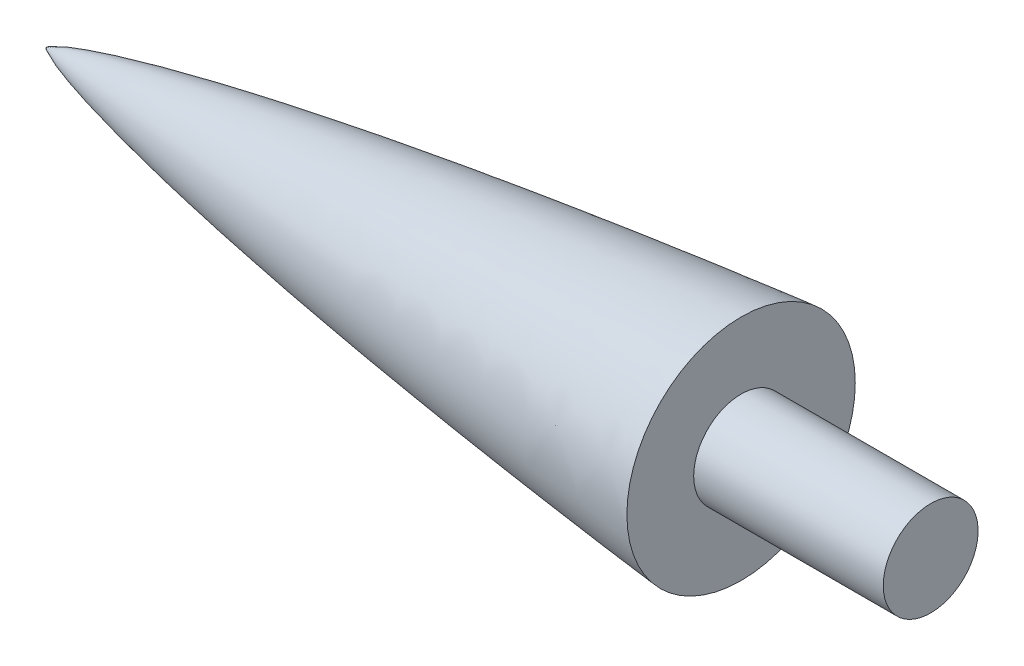
ISO-10303-21;
HEADER;
FILE_DESCRIPTION(('STEP AP214'),'2;1');
FILE_NAME('part.step','',(''),(''),'','','');
FILE_SCHEMA(('AUTOMOTIVE_DESIGN { 1 0 10303 214 1 1 1 1 }'));
ENDSEC;
DATA;
#1=APPLICATION_CONTEXT('core data for automotive mechanical design processes');
#2=APPLICATION_PROTOCOL_DEFINITION('international standard','automotive_design',2000,#1);
#3=PRODUCT_CONTEXT('',#1,'mechanical');
#4=PRODUCT('Part','Part','',(#3));
#5=PRODUCT_RELATED_PRODUCT_CATEGORY('part','',(#4));
#6=PRODUCT_DEFINITION_FORMATION('','',#4);
#7=PRODUCT_DEFINITION_CONTEXT('part definition',#1,'design');
#8=PRODUCT_DEFINITION('design','',#6,#7);
#9=PRODUCT_DEFINITION_SHAPE('','',#8);
#10=(LENGTH_UNIT() NAMED_UNIT(*) SI_UNIT(.MILLI.,.METRE.));
#11=(NAMED_UNIT(*) PLANE_ANGLE_UNIT() SI_UNIT($,.RADIAN.));
#12=(NAMED_UNIT(*) SI_UNIT($,.STERADIAN.) SOLID_ANGLE_UNIT());
#13=UNCERTAINTY_MEASURE_WITH_UNIT(LENGTH_MEASURE(1.E-05),#10,'distance_accuracy_value','');
#14=(GEOMETRIC_REPRESENTATION_CONTEXT(3) GLOBAL_UNCERTAINTY_ASSIGNED_CONTEXT((#13)) GLOBAL_UNIT_ASSIGNED_CONTEXT((#10,
#11,#12)) REPRESENTATION_CONTEXT('',''));
#15=CARTESIAN_POINT('',(0.,0.,0.));
#16=DIRECTION('',(0.,0.,1.));
#17=DIRECTION('',(1.,0.,0.));
#18=AXIS2_PLACEMENT_3D('',#15,#16,#17);
#19=CARTESIAN_POINT('',(0.,0.,0.));
#20=DIRECTION('',(-1.,0.,0.));
#21=DIRECTION('',(0.,0.,1.));
#22=AXIS2_PLACEMENT_3D('',#19,#20,#21);
#23=CYLINDRICAL_SURFACE('',#22,12.7000000000769);
#24=CARTESIAN_POINT('',(186.200000001144,0.,0.));
#25=DIRECTION('',(-1.,0.,0.));
#26=DIRECTION('',(0.,0.,1.));
#27=AXIS2_PLACEMENT_3D('',#24,#25,#26);
#28=CIRCLE('',#27,12.7000000000769);
#29=CARTESIAN_POINT('',(186.200000001144,0.,12.7000000000769));
#30=VERTEX_POINT('',#29);
#31=EDGE_CURVE('E11',#30,#30,#28,.T.);
#32=ORIENTED_EDGE('',*,*,#31,.F.);
#33=EDGE_LOOP('',(#32));
#34=FACE_BOUND('',#33,.T.);
#35=CARTESIAN_POINT('',(237.,0.,0.));
#36=DIRECTION('',(-1.,0.,0.));
#37=DIRECTION('',(0.,0.,1.));
#38=AXIS2_PLACEMENT_3D('',#35,#36,#37);
#39=CIRCLE('',#38,12.7000000000769);
#40=CARTESIAN_POINT('',(237.,0.,12.7000000000769));
#41=VERTEX_POINT('',#40);
#42=EDGE_CURVE('E65',#41,#41,#39,.T.);
#43=ORIENTED_EDGE('',*,*,#42,.T.);
#44=EDGE_LOOP('',(#43));
#45=FACE_BOUND('',#44,.T.);
#46=ADVANCED_FACE('F45',(#34,#45),#23,.T.);
#47=CARTESIAN_POINT('',(186.20000000124,0.,-12.7000000000769));
#48=DIRECTION('',(-1.,0.,0.));
#49=DIRECTION('',(0.,0.,1.));
#50=AXIS2_PLACEMENT_3D('',#47,#48,#49);
#51=PLANE('',#50);
#52=CARTESIAN_POINT('',(186.200000001335,0.,0.));
#53=DIRECTION('',(-1.,0.,0.));
#54=DIRECTION('',(0.,0.,1.));
#55=AXIS2_PLACEMENT_3D('',#52,#53,#54);
#56=CIRCLE('',#55,30.5941707055028);
#57=CARTESIAN_POINT('',(186.200000001335,0.,30.5941707055028));
#58=VERTEX_POINT('',#57);
#59=EDGE_CURVE('E52',#58,#58,#56,.T.);
#60=ORIENTED_EDGE('',*,*,#59,.F.);
#61=EDGE_LOOP('',(#60));
#62=FACE_BOUND('',#61,.T.);
#63=ORIENTED_EDGE('',*,*,#31,.T.);
#64=EDGE_LOOP('',(#63));
#65=FACE_BOUND('',#64,.T.);
#66=ADVANCED_FACE('F59',(#62,#65),#51,.F.);
#67=CARTESIAN_POINT('',(186.200000001335,0.,-30.5941707055028));
#68=CARTESIAN_POINT('',(184.662407070219,0.,-30.4392578753712));
#69=CARTESIAN_POINT('',(181.664721368419,0.,-30.1345686694841));
#70=CARTESIAN_POINT('',(175.520193145905,0.,-29.5033768760342));
#71=CARTESIAN_POINT('',(169.640854592531,0.,-28.8781554590312));
#72=CARTESIAN_POINT('',(162.343077764836,0.,-28.0928203912281));
#73=CARTESIAN_POINT('',(155.948282856683,0.,-27.3807097930227));
#74=CARTESIAN_POINT('',(149.811116787043,0.,-26.6869796348611));
#75=CARTESIAN_POINT('',(144.877547534649,0.,-26.113408571817));
#76=CARTESIAN_POINT('',(139.753375696122,0.,-25.5108613461649));
#77=CARTESIAN_POINT('',(134.732708793236,0.,-24.9087817091693));
#78=CARTESIAN_POINT('',(128.81067856445,0.,-24.1848807119387));
#79=CARTESIAN_POINT('',(120.397645133949,0.,-23.1287132910105));
#80=CARTESIAN_POINT('',(110.285220260477,0.,-21.8148001535127));
#81=CARTESIAN_POINT('',(100.194023174279,0.,-20.4428386621385));
#82=CARTESIAN_POINT('',(90.1037764473322,0.,-19.003577807201));
#83=CARTESIAN_POINT('',(80.0264372503359,0.,-17.5059515675425));
#84=CARTESIAN_POINT('',(69.9564167642104,0.,-15.9447415224614));
#85=CARTESIAN_POINT('',(58.2260375733927,0.,-14.0196412347053));
#86=CARTESIAN_POINT('',(44.84839358411,0.,-11.6455232124935));
#87=CARTESIAN_POINT('',(32.222331949912,0.,-9.18514909763235));
#88=CARTESIAN_POINT('',(21.4403752490037,0.,-6.83377987904622));
#89=CARTESIAN_POINT('',(13.1064586472237,0.,-4.75920276513738));
#90=CARTESIAN_POINT('',(7.60236751203477,0.,-3.17385571636364));
#91=CARTESIAN_POINT('',(4.41392468250558,0.,-2.11488278146902));
#92=CARTESIAN_POINT('',(2.57407141296526,0.,-1.41163730075778));
#93=CARTESIAN_POINT('',(1.54018043583499,0.,-0.959829812667753));
#94=CARTESIAN_POINT('',(0.952068497650011,0.,-0.668617104150526));
#95=CARTESIAN_POINT('',(0.606995268094673,0.,-0.476664104372928));
#96=CARTESIAN_POINT('',(0.394881665147901,0.,-0.345155619052086));
#97=CARTESIAN_POINT('',(0.265098068533639,0.,-0.25590111197058));
#98=CARTESIAN_POINT('',(0.178077987085558,0.,-0.189836562428967));
#99=CARTESIAN_POINT('',(0.114237307946382,0.,-0.136257230623688));
#100=CARTESIAN_POINT('',(0.0700573409504292,0.,-0.0951693489716034));
#101=CARTESIAN_POINT('',(0.0337925470818379,0.,-0.0558676875837313));
#102=CARTESIAN_POINT('',(0.0110752134484783,0.,-0.0257358999075582));
#103=CARTESIAN_POINT('',(0.00310882406169207,0.,-0.00887746428807615));
#104=CARTESIAN_POINT('',(0.,0.,0.));
#105=B_SPLINE_CURVE_WITH_KNOTS('',4,(#67,#68,#69,#70,#71,#72,#73,#74,#75,#76,#77,#78,#79,#80,
#81,#82,#83,#84,#85,#86,#87,#88,#89,#90,#91,#92,#93,#94,#95,#96,#97,#98,#99,#100,#101,#102,#103,
#104),.UNSPECIFIED.,.F.,.F.,(5,1,1,1,1,1,1,1,1,1,1,1,1,1,1,1,1,1,1,1,1,1,1,1,1,1,1,1,1,1,1,1,1,
1,5),(0.,0.0326810335908452,0.0653620671816904,0.0980431008847118,0.130724134587733,
0.163405168367008,0.196086202146282,0.212426719054658,0.228767235963034,0.261448269779786,
0.294129303578273,0.32681033737676,0.392172404824504,0.457534472134687,0.490215505946359,
0.52289653975803,0.588258608906454,0.6536206730453,0.718982743065276,0.784344810540166,
0.835796033405464,0.865960446156128,0.884227223187027,0.894546329069303,0.900432579829851,
0.90385239756026,0.905932811279427,0.907170919997491,0.908028786361658,0.90865351857146,
0.908962980955325,0.90927244333919,0.909632668951372,0.909812781757463,0.909992894563555),.UNSPECIFIED.);
#106=CARTESIAN_POINT('',(0.,0.,0.));
#107=DIRECTION('',(-1.,0.,0.));
#108=AXIS1_PLACEMENT('',#106,#107);
#109=SURFACE_OF_REVOLUTION('',#105,#108);
#110=CARTESIAN_POINT('',(0.,0.,0.));
#111=VERTEX_POINT('',#110);
#112=VERTEX_LOOP('',#111);
#113=FACE_BOUND('',#112,.T.);
#114=ORIENTED_EDGE('',*,*,#59,.T.);
#115=EDGE_LOOP('',(#114));
#116=FACE_BOUND('',#115,.T.);
#117=ADVANCED_FACE('F55',(#113,#116),#109,.T.);
#118=CARTESIAN_POINT('',(237.,0.,0.));
#119=DIRECTION('',(-1.,0.,0.));
#120=DIRECTION('',(0.,0.,1.));
#121=AXIS2_PLACEMENT_3D('',#118,#119,#120);
#122=PLANE('',#121);
#123=ORIENTED_EDGE('',*,*,#42,.F.);
#124=EDGE_LOOP('',(#123));
#125=FACE_BOUND('',#124,.T.);
#126=ADVANCED_FACE('F58',(#125),#122,.F.);
#127=CLOSED_SHELL('',(#46,#66,#117,#126));
#128=MANIFOLD_SOLID_BREP('B2',#127);
#129=ADVANCED_BREP_SHAPE_REPRESENTATION('',(#18,#128),#14);
#130=SHAPE_DEFINITION_REPRESENTATION(#9,#129);
ENDSEC;
END-ISO-10303-21;
